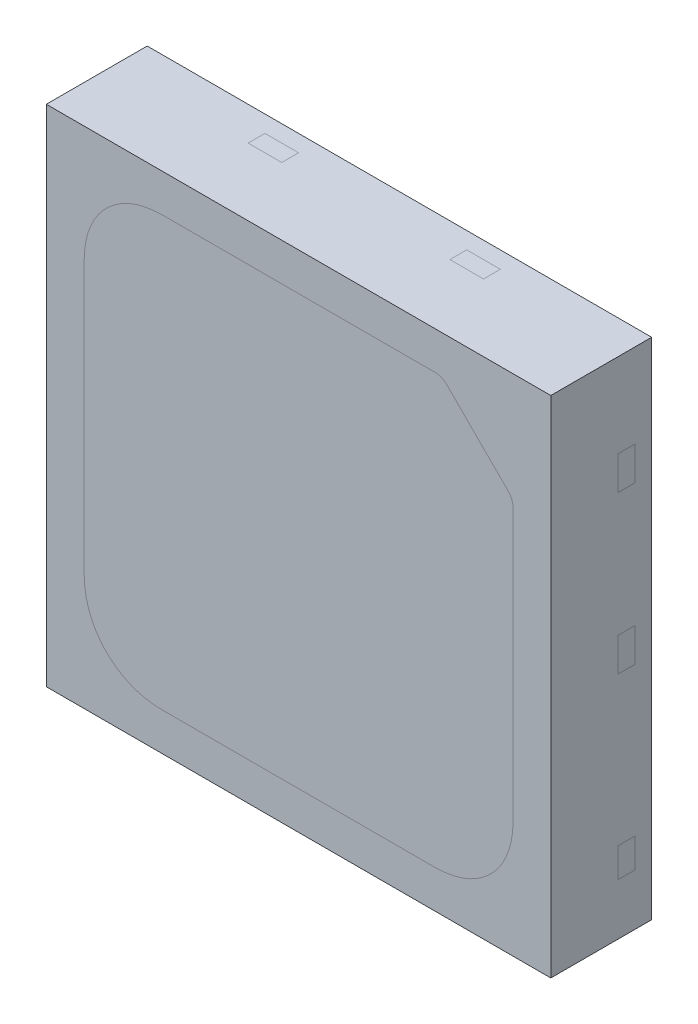
ISO-10303-21;
HEADER;
FILE_DESCRIPTION(('STEP AP214'),'2;1');
FILE_NAME('part.step','',(''),(''),'','','');
FILE_SCHEMA(('AUTOMOTIVE_DESIGN { 1 0 10303 214 1 1 1 1 }'));
ENDSEC;
DATA;
#1=APPLICATION_CONTEXT('core data for automotive mechanical design processes');
#2=APPLICATION_PROTOCOL_DEFINITION('international standard','automotive_design',2000,#1);
#3=PRODUCT_CONTEXT('',#1,'mechanical');
#4=PRODUCT('Part','Part','',(#3));
#5=PRODUCT_RELATED_PRODUCT_CATEGORY('part','',(#4));
#6=PRODUCT_DEFINITION_FORMATION('','',#4);
#7=PRODUCT_DEFINITION_CONTEXT('part definition',#1,'design');
#8=PRODUCT_DEFINITION('design','',#6,#7);
#9=PRODUCT_DEFINITION_SHAPE('','',#8);
#10=(LENGTH_UNIT() NAMED_UNIT(*) SI_UNIT(.MILLI.,.METRE.));
#11=(NAMED_UNIT(*) PLANE_ANGLE_UNIT() SI_UNIT($,.RADIAN.));
#12=(NAMED_UNIT(*) SI_UNIT($,.STERADIAN.) SOLID_ANGLE_UNIT());
#13=UNCERTAINTY_MEASURE_WITH_UNIT(LENGTH_MEASURE(1.E-05),#10,'distance_accuracy_value','');
#14=(GEOMETRIC_REPRESENTATION_CONTEXT(3) GLOBAL_UNCERTAINTY_ASSIGNED_CONTEXT((#13)) GLOBAL_UNIT_ASSIGNED_CONTEXT((#10,
#11,#12)) REPRESENTATION_CONTEXT('',''));
#15=CARTESIAN_POINT('',(0.,0.,0.));
#16=DIRECTION('',(0.,0.,1.));
#17=DIRECTION('',(1.,0.,0.));
#18=AXIS2_PLACEMENT_3D('',#15,#16,#17);
#19=CARTESIAN_POINT('',(-0.900000085160002,-1.24499989786669,0.));
#20=DIRECTION('',(0.,0.,1.));
#21=DIRECTION('',(1.,0.,0.));
#22=AXIS2_PLACEMENT_3D('',#19,#20,#21);
#23=PLANE('',#22);
#24=DIRECTION('',(-1.,0.,0.));
#25=VECTOR('',#24,1.);
#26=CARTESIAN_POINT('',(1.5,-0.764999897866658,0.));
#27=LINE('',#26,#25);
#28=CARTESIAN_POINT('',(0.900000000335438,-0.764999897866658,0.));
#29=VERTEX_POINT('',#28);
#30=CARTESIAN_POINT('',(-0.900000085160002,-0.764999897866658,0.));
#31=VERTEX_POINT('',#30);
#32=EDGE_CURVE('E129',#29,#31,#27,.T.);
#33=ORIENTED_EDGE('',*,*,#32,.F.);
#34=CARTESIAN_POINT('',(1.00000000033543,-0.864999897866647,0.));
#35=CARTESIAN_POINT('',(0.998684304954096,-0.822997155944478,0.));
#36=CARTESIAN_POINT('',(0.970970174894681,-0.794553357773646,0.));
#37=CARTESIAN_POINT('',(0.943508522697015,-0.76636868479732,0.));
#38=CARTESIAN_POINT('',(0.900000000335438,-0.764999897866658,0.));
#39=B_SPLINE_CURVE_WITH_KNOTS('',2,(#34,#35,#36,#37,#38),.UNSPECIFIED.,.F.,.F.,(3,2,3),(0.,0.5,
1.),.UNSPECIFIED.);
#40=CARTESIAN_POINT('',(1.00000000033543,-0.864999897866647,0.));
#41=VERTEX_POINT('',#40);
#42=EDGE_CURVE('E132',#41,#29,#39,.T.);
#43=ORIENTED_EDGE('',*,*,#42,.F.);
#44=DIRECTION('',(0.,1.,0.));
#45=VECTOR('',#44,1.);
#46=CARTESIAN_POINT('',(1.00000000033543,-1.24499989786669,0.));
#47=LINE('',#46,#45);
#48=CARTESIAN_POINT('',(1.00000000033543,-1.24499989786669,0.));
#49=VERTEX_POINT('',#48);
#50=EDGE_CURVE('E18',#49,#41,#47,.T.);
#51=ORIENTED_EDGE('',*,*,#50,.F.);
#52=CARTESIAN_POINT('',(0.900000000335438,-1.34499989786666,0.));
#53=CARTESIAN_POINT('',(0.942002742257597,-1.34368420248534,0.));
#54=CARTESIAN_POINT('',(0.970446540428437,-1.31597007242593,0.));
#55=CARTESIAN_POINT('',(0.998631213404765,-1.28850842022828,0.));
#56=CARTESIAN_POINT('',(1.00000000033543,-1.24499989786669,0.));
#57=B_SPLINE_CURVE_WITH_KNOTS('',2,(#52,#53,#54,#55,#56),.UNSPECIFIED.,.F.,.F.,(3,2,3),(0.,0.5,
1.),.UNSPECIFIED.);
#58=CARTESIAN_POINT('',(0.900000000335438,-1.34499989786666,0.));
#59=VERTEX_POINT('',#58);
#60=EDGE_CURVE('E107',#59,#49,#57,.T.);
#61=ORIENTED_EDGE('',*,*,#60,.F.);
#62=DIRECTION('',(-1.,0.,0.));
#63=VECTOR('',#62,1.);
#64=CARTESIAN_POINT('',(1.5,-1.34499989786666,0.));
#65=LINE('',#64,#63);
#66=CARTESIAN_POINT('',(-0.900000085160002,-1.34499989786666,0.));
#67=VERTEX_POINT('',#66);
#68=EDGE_CURVE('E109',#67,#59,#65,.F.);
#69=ORIENTED_EDGE('',*,*,#68,.F.);
#70=CARTESIAN_POINT('',(-1.00000008515999,-1.24499989786669,0.));
#71=CARTESIAN_POINT('',(-0.99868438977866,-1.28700263978886,0.));
#72=CARTESIAN_POINT('',(-0.970970259719245,-1.31544643795969,0.));
#73=CARTESIAN_POINT('',(-0.943508607521579,-1.34363111093601,0.));
#74=CARTESIAN_POINT('',(-0.900000085160002,-1.34499989786666,0.));
#75=B_SPLINE_CURVE_WITH_KNOTS('',2,(#70,#71,#72,#73,#74),.UNSPECIFIED.,.F.,.F.,(3,2,3),(0.,0.5,
1.),.UNSPECIFIED.);
#76=CARTESIAN_POINT('',(-1.00000008515999,-1.24499989786669,0.));
#77=VERTEX_POINT('',#76);
#78=EDGE_CURVE('E116',#77,#67,#75,.T.);
#79=ORIENTED_EDGE('',*,*,#78,.F.);
#80=DIRECTION('',(0.,1.,0.));
#81=VECTOR('',#80,1.);
#82=CARTESIAN_POINT('',(-1.00000008515999,1.5,0.));
#83=LINE('',#82,#81);
#84=CARTESIAN_POINT('',(-1.00000008515999,-0.864999897866647,0.));
#85=VERTEX_POINT('',#84);
#86=EDGE_CURVE('E122',#85,#77,#83,.F.);
#87=ORIENTED_EDGE('',*,*,#86,.F.);
#88=CARTESIAN_POINT('',(-0.900000085160002,-0.764999897866658,0.));
#89=CARTESIAN_POINT('',(-0.942002827082158,-0.766315593247989,0.));
#90=CARTESIAN_POINT('',(-0.970446625252997,-0.794029723307398,0.));
#91=CARTESIAN_POINT('',(-0.998631298229329,-0.821491375505056,0.));
#92=CARTESIAN_POINT('',(-1.00000008515999,-0.864999897866647,0.));
#93=B_SPLINE_CURVE_WITH_KNOTS('',2,(#88,#89,#90,#91,#92),.UNSPECIFIED.,.F.,.F.,(3,2,3),(0.,0.5,
1.),.UNSPECIFIED.);
#94=EDGE_CURVE('E128',#31,#85,#93,.T.);
#95=ORIENTED_EDGE('',*,*,#94,.F.);
#96=EDGE_LOOP('',(#33,#43,#51,#61,#69,#79,#87,#95));
#97=FACE_BOUND('',#96,.T.);
#98=ADVANCED_FACE('F15',(#97),#23,.F.);
#99=CARTESIAN_POINT('',(1.10000001458468,1.23500010213334,0.));
#100=DIRECTION('',(0.,0.,-1.));
#101=DIRECTION('',(-1.,0.,0.));
#102=AXIS2_PLACEMENT_3D('',#99,#100,#101);
#103=PLANE('',#102);
#104=CARTESIAN_POINT('',(1.10000001458468,-0.214999897866663,0.));
#105=CARTESIAN_POINT('',(1.14200275650685,-0.213684202485333,0.));
#106=CARTESIAN_POINT('',(1.17044655467768,-0.185970072425921,0.));
#107=CARTESIAN_POINT('',(1.19863122765401,-0.15850842022826,0.));
#108=CARTESIAN_POINT('',(1.20000001458467,-0.114999897866674,0.));
#109=B_SPLINE_CURVE_WITH_KNOTS('',2,(#104,#105,#106,#107,#108),.UNSPECIFIED.,.F.,.F.,(3,2,3),
(0.,0.5,1.),.UNSPECIFIED.);
#110=CARTESIAN_POINT('',(1.10000001458468,-0.214999897866663,0.));
#111=VERTEX_POINT('',#110);
#112=CARTESIAN_POINT('',(1.20000001458467,-0.114999897866674,0.));
#113=VERTEX_POINT('',#112);
#114=EDGE_CURVE('E196',#111,#113,#109,.T.);
#115=ORIENTED_EDGE('',*,*,#114,.F.);
#116=DIRECTION('',(-1.,0.,0.));
#117=VECTOR('',#116,1.);
#118=CARTESIAN_POINT('',(1.5,-0.214999897866663,0.));
#119=LINE('',#118,#117);
#120=CARTESIAN_POINT('',(-1.10003380164489,-0.214999897866663,0.));
#121=VERTEX_POINT('',#120);
#122=EDGE_CURVE('E120',#121,#111,#119,.F.);
#123=ORIENTED_EDGE('',*,*,#122,.F.);
#124=CARTESIAN_POINT('',(-1.20003380164488,-0.114999897866674,0.));
#125=CARTESIAN_POINT('',(-1.19871810626355,-0.157002639788836,0.));
#126=CARTESIAN_POINT('',(-1.17100397620413,-0.185446437959674,0.));
#127=CARTESIAN_POINT('',(-1.14354232400648,-0.213631110936001,0.));
#128=CARTESIAN_POINT('',(-1.10003380164489,-0.214999897866663,0.));
#129=B_SPLINE_CURVE_WITH_KNOTS('',2,(#124,#125,#126,#127,#128),.UNSPECIFIED.,.F.,.F.,(3,2,3),
(0.,0.5,1.),.UNSPECIFIED.);
#130=CARTESIAN_POINT('',(-1.20003380164488,-0.114999897866674,0.));
#131=VERTEX_POINT('',#130);
#132=EDGE_CURVE('E117',#131,#121,#129,.T.);
#133=ORIENTED_EDGE('',*,*,#132,.F.);
#134=DIRECTION('',(0.,1.,0.));
#135=VECTOR('',#134,1.);
#136=CARTESIAN_POINT('',(-1.20003380164488,1.23500010213334,0.));
#137=LINE('',#136,#135);
#138=CARTESIAN_POINT('',(-1.20003380164488,1.23500010213334,0.));
#139=VERTEX_POINT('',#138);
#140=EDGE_CURVE('E135',#131,#139,#137,.T.);
#141=ORIENTED_EDGE('',*,*,#140,.T.);
#142=CARTESIAN_POINT('',(-1.20003380164488,1.23500010213334,0.));
#143=CARTESIAN_POINT('',(-1.1986949889653,1.27755585723485,0.));
#144=CARTESIAN_POINT('',(-1.17048034173789,1.30597027669259,0.));
#145=CARTESIAN_POINT('',(-1.14299073953656,1.33365451748353,0.));
#146=CARTESIAN_POINT('',(-1.10003380164489,1.33500010213333,0.));
#147=B_SPLINE_CURVE_WITH_KNOTS('',2,(#142,#143,#144,#145,#146),.UNSPECIFIED.,.F.,.F.,(3,2,3),
(0.,0.5,1.),.UNSPECIFIED.);
#148=CARTESIAN_POINT('',(-1.10003380164489,1.33500010213333,0.));
#149=VERTEX_POINT('',#148);
#150=EDGE_CURVE('E133',#139,#149,#147,.T.);
#151=ORIENTED_EDGE('',*,*,#150,.T.);
#152=DIRECTION('',(-1.,0.,0.));
#153=VECTOR('',#152,1.);
#154=CARTESIAN_POINT('',(1.5,1.33500010213333,0.));
#155=LINE('',#154,#153);
#156=CARTESIAN_POINT('',(1.10000001458468,1.33500010213333,0.));
#157=VERTEX_POINT('',#156);
#158=EDGE_CURVE('E209',#157,#149,#155,.T.);
#159=ORIENTED_EDGE('',*,*,#158,.F.);
#160=CARTESIAN_POINT('',(1.20000001458467,1.23500010213334,0.));
#161=CARTESIAN_POINT('',(1.19868431920334,1.2770028440555,0.));
#162=CARTESIAN_POINT('',(1.17097018914393,1.30544664222634,0.));
#163=CARTESIAN_POINT('',(1.14350853694627,1.33363131520267,0.));
#164=CARTESIAN_POINT('',(1.10000001458468,1.33500010213333,0.));
#165=B_SPLINE_CURVE_WITH_KNOTS('',2,(#160,#161,#162,#163,#164),.UNSPECIFIED.,.F.,.F.,(3,2,3),
(0.,0.5,1.),.UNSPECIFIED.);
#166=CARTESIAN_POINT('',(1.20000001458467,1.23500010213334,0.));
#167=VERTEX_POINT('',#166);
#168=EDGE_CURVE('E200',#167,#157,#165,.T.);
#169=ORIENTED_EDGE('',*,*,#168,.F.);
#170=DIRECTION('',(0.,1.,0.));
#171=VECTOR('',#170,1.);
#172=CARTESIAN_POINT('',(1.20000001458467,1.5,0.));
#173=LINE('',#172,#171);
#174=EDGE_CURVE('E199',#113,#167,#173,.T.);
#175=ORIENTED_EDGE('',*,*,#174,.F.);
#176=EDGE_LOOP('',(#115,#123,#133,#141,#151,#159,#169,#175));
#177=FACE_BOUND('',#176,.T.);
#178=ADVANCED_FACE('F136',(#177),#103,.T.);
#179=CARTESIAN_POINT('',(-1.49999999724315,1.49999999724315,0.2));
#180=DIRECTION('',(0.,1.,0.));
#181=DIRECTION('',(0.,0.,1.));
#182=AXIS2_PLACEMENT_3D('',#179,#180,#181);
#183=PLANE('',#182);
#184=DIRECTION('',(0.,0.,-1.));
#185=VECTOR('',#184,1.);
#186=CARTESIAN_POINT('',(-0.699999998621359,1.5,0.6));
#187=LINE('',#186,#185);
#188=CARTESIAN_POINT('',(-0.699999998621359,1.49999999862158,0.1));
#189=VERTEX_POINT('',#188);
#190=CARTESIAN_POINT('',(-0.699999998621359,1.49999999862158,0.2));
#191=VERTEX_POINT('',#190);
#192=EDGE_CURVE('E236',#189,#191,#187,.F.);
#193=ORIENTED_EDGE('',*,*,#192,.T.);
#194=DIRECTION('',(1.,0.,0.));
#195=VECTOR('',#194,1.);
#196=CARTESIAN_POINT('',(-1.5,1.5,0.2));
#197=LINE('',#196,#195);
#198=CARTESIAN_POINT('',(-0.499999998621409,1.49999999862158,0.2));
#199=VERTEX_POINT('',#198);
#200=EDGE_CURVE('E216',#191,#199,#197,.T.);
#201=ORIENTED_EDGE('',*,*,#200,.T.);
#202=DIRECTION('',(0.,0.,-1.));
#203=VECTOR('',#202,1.);
#204=CARTESIAN_POINT('',(-0.499999998621409,1.5,0.6));
#205=LINE('',#204,#203);
#206=CARTESIAN_POINT('',(-0.499999998621409,1.49999999862158,0.1));
#207=VERTEX_POINT('',#206);
#208=EDGE_CURVE('E225',#199,#207,#205,.T.);
#209=ORIENTED_EDGE('',*,*,#208,.T.);
#210=DIRECTION('',(1.,0.,0.));
#211=VECTOR('',#210,1.);
#212=CARTESIAN_POINT('',(-1.5,1.5,0.1));
#213=LINE('',#212,#211);
#214=EDGE_CURVE('E231',#207,#189,#213,.F.);
#215=ORIENTED_EDGE('',*,*,#214,.T.);
#216=EDGE_LOOP('',(#193,#201,#209,#215));
#217=FACE_BOUND('',#216,.T.);
#218=ADVANCED_FACE('F145',(#217),#183,.T.);
#219=CARTESIAN_POINT('',(-1.49999999724315,1.49999999724315,0.2));
#220=DIRECTION('',(0.,1.,0.));
#221=DIRECTION('',(0.,0.,1.));
#222=AXIS2_PLACEMENT_3D('',#219,#220,#221);
#223=PLANE('',#222);
#224=DIRECTION('',(0.,0.,-1.));
#225=VECTOR('',#224,1.);
#226=CARTESIAN_POINT('',(0.500000001378259,1.5,0.6));
#227=LINE('',#226,#225);
#228=CARTESIAN_POINT('',(0.500000001378259,1.49999999862158,0.1));
#229=VERTEX_POINT('',#228);
#230=CARTESIAN_POINT('',(0.500000001378259,1.49999999862158,0.2));
#231=VERTEX_POINT('',#230);
#232=EDGE_CURVE('E250',#229,#231,#227,.F.);
#233=ORIENTED_EDGE('',*,*,#232,.T.);
#234=DIRECTION('',(1.,0.,0.));
#235=VECTOR('',#234,1.);
#236=CARTESIAN_POINT('',(-1.5,1.5,0.2));
#237=LINE('',#236,#235);
#238=CARTESIAN_POINT('',(0.700000001378209,1.49999999862158,0.2));
#239=VERTEX_POINT('',#238);
#240=EDGE_CURVE('E241',#231,#239,#237,.T.);
#241=ORIENTED_EDGE('',*,*,#240,.T.);
#242=DIRECTION('',(0.,0.,-1.));
#243=VECTOR('',#242,1.);
#244=CARTESIAN_POINT('',(0.700000001378209,1.5,0.6));
#245=LINE('',#244,#243);
#246=CARTESIAN_POINT('',(0.700000001378209,1.49999999862158,0.1));
#247=VERTEX_POINT('',#246);
#248=EDGE_CURVE('E244',#239,#247,#245,.T.);
#249=ORIENTED_EDGE('',*,*,#248,.T.);
#250=DIRECTION('',(1.,0.,0.));
#251=VECTOR('',#250,1.);
#252=CARTESIAN_POINT('',(-1.5,1.5,0.1));
#253=LINE('',#252,#251);
#254=EDGE_CURVE('E247',#247,#229,#253,.F.);
#255=ORIENTED_EDGE('',*,*,#254,.T.);
#256=EDGE_LOOP('',(#233,#241,#249,#255));
#257=FACE_BOUND('',#256,.T.);
#258=ADVANCED_FACE('F149',(#257),#223,.T.);
#259=CARTESIAN_POINT('',(1.49999999999999,0.,0.));
#260=DIRECTION('',(-1.,0.,0.));
#261=DIRECTION('',(0.,0.,1.));
#262=AXIS2_PLACEMENT_3D('',#259,#260,#261);
#263=PLANE('',#262);
#264=DIRECTION('',(0.,0.,1.));
#265=VECTOR('',#264,1.);
#266=CARTESIAN_POINT('',(1.5,1.0000000496882,0.6));
#267=LINE('',#266,#265);
#268=CARTESIAN_POINT('',(1.5,1.0000000496882,0.1));
#269=VERTEX_POINT('',#268);
#270=CARTESIAN_POINT('',(1.5,1.0000000496882,0.2));
#271=VERTEX_POINT('',#270);
#272=EDGE_CURVE('E268',#269,#271,#267,.T.);
#273=ORIENTED_EDGE('',*,*,#272,.T.);
#274=DIRECTION('',(0.,1.,0.));
#275=VECTOR('',#274,1.);
#276=CARTESIAN_POINT('',(1.5,-1.5,0.2));
#277=LINE('',#276,#275);
#278=CARTESIAN_POINT('',(1.5,0.800000049688165,0.2));
#279=VERTEX_POINT('',#278);
#280=EDGE_CURVE('E259',#271,#279,#277,.F.);
#281=ORIENTED_EDGE('',*,*,#280,.T.);
#282=DIRECTION('',(0.,0.,1.));
#283=VECTOR('',#282,1.);
#284=CARTESIAN_POINT('',(1.5,0.800000049688165,0.6));
#285=LINE('',#284,#283);
#286=CARTESIAN_POINT('',(1.5,0.800000049688165,0.1));
#287=VERTEX_POINT('',#286);
#288=EDGE_CURVE('E262',#279,#287,#285,.F.);
#289=ORIENTED_EDGE('',*,*,#288,.T.);
#290=DIRECTION('',(0.,1.,0.));
#291=VECTOR('',#290,1.);
#292=CARTESIAN_POINT('',(1.5,-1.5,0.1));
#293=LINE('',#292,#291);
#294=EDGE_CURVE('E265',#287,#269,#293,.T.);
#295=ORIENTED_EDGE('',*,*,#294,.T.);
#296=EDGE_LOOP('',(#273,#281,#289,#295));
#297=FACE_BOUND('',#296,.T.);
#298=ADVANCED_FACE('F153',(#297),#263,.F.);
#299=CARTESIAN_POINT('',(1.5,0.,0.));
#300=DIRECTION('',(1.,0.,0.));
#301=DIRECTION('',(0.,0.,-1.));
#302=AXIS2_PLACEMENT_3D('',#299,#300,#301);
#303=PLANE('',#302);
#304=DIRECTION('',(0.,1.,0.));
#305=VECTOR('',#304,1.);
#306=CARTESIAN_POINT('',(1.5,-1.5,0.2));
#307=LINE('',#306,#305);
#308=CARTESIAN_POINT('',(1.5,0.0647629025983254,0.2));
#309=VERTEX_POINT('',#308);
#310=CARTESIAN_POINT('',(1.5,-0.135237097401708,0.2));
#311=VERTEX_POINT('',#310);
#312=EDGE_CURVE('E271',#309,#311,#307,.F.);
#313=ORIENTED_EDGE('',*,*,#312,.T.);
#314=DIRECTION('',(0.,0.,1.));
#315=VECTOR('',#314,1.);
#316=CARTESIAN_POINT('',(1.5,-0.135237097401708,0.6));
#317=LINE('',#316,#315);
#318=CARTESIAN_POINT('',(1.5,-0.135237097401708,0.1));
#319=VERTEX_POINT('',#318);
#320=EDGE_CURVE('E274',#311,#319,#317,.F.);
#321=ORIENTED_EDGE('',*,*,#320,.T.);
#322=DIRECTION('',(0.,1.,0.));
#323=VECTOR('',#322,1.);
#324=CARTESIAN_POINT('',(1.5,-1.5,0.1));
#325=LINE('',#324,#323);
#326=CARTESIAN_POINT('',(1.5,0.0647629025983254,0.1));
#327=VERTEX_POINT('',#326);
#328=EDGE_CURVE('E277',#319,#327,#325,.T.);
#329=ORIENTED_EDGE('',*,*,#328,.T.);
#330=DIRECTION('',(0.,0.,1.));
#331=VECTOR('',#330,1.);
#332=CARTESIAN_POINT('',(1.5,0.0647629025983254,0.6));
#333=LINE('',#332,#331);
#334=EDGE_CURVE('E280',#327,#309,#333,.T.);
#335=ORIENTED_EDGE('',*,*,#334,.T.);
#336=EDGE_LOOP('',(#313,#321,#329,#335));
#337=FACE_BOUND('',#336,.T.);
#338=ADVANCED_FACE('F157',(#337),#303,.T.);
#339=CARTESIAN_POINT('',(1.5,0.,0.));
#340=DIRECTION('',(-1.,0.,0.));
#341=DIRECTION('',(0.,-1.,0.));
#342=AXIS2_PLACEMENT_3D('',#339,#340,#341);
#343=PLANE('',#342);
#344=DIRECTION('',(0.,0.,1.));
#345=VECTOR('',#344,1.);
#346=CARTESIAN_POINT('',(1.5,-1.01890774120183,0.6));
#347=LINE('',#346,#345);
#348=CARTESIAN_POINT('',(1.5,-1.01890774120183,0.1));
#349=VERTEX_POINT('',#348);
#350=CARTESIAN_POINT('',(1.5,-1.01890774120183,0.2));
#351=VERTEX_POINT('',#350);
#352=EDGE_CURVE('E292',#349,#351,#347,.T.);
#353=ORIENTED_EDGE('',*,*,#352,.T.);
#354=DIRECTION('',(0.,1.,0.));
#355=VECTOR('',#354,1.);
#356=CARTESIAN_POINT('',(1.5,-1.5,0.2));
#357=LINE('',#356,#355);
#358=CARTESIAN_POINT('',(1.5,-1.19390774120187,0.2));
#359=VERTEX_POINT('',#358);
#360=EDGE_CURVE('E283',#351,#359,#357,.F.);
#361=ORIENTED_EDGE('',*,*,#360,.T.);
#362=DIRECTION('',(0.,0.,1.));
#363=VECTOR('',#362,1.);
#364=CARTESIAN_POINT('',(1.5,-1.19390774120187,0.6));
#365=LINE('',#364,#363);
#366=CARTESIAN_POINT('',(1.5,-1.19390774120187,0.1));
#367=VERTEX_POINT('',#366);
#368=EDGE_CURVE('E286',#359,#367,#365,.F.);
#369=ORIENTED_EDGE('',*,*,#368,.T.);
#370=DIRECTION('',(0.,1.,0.));
#371=VECTOR('',#370,1.);
#372=CARTESIAN_POINT('',(1.5,-1.5,0.1));
#373=LINE('',#372,#371);
#374=EDGE_CURVE('E289',#367,#349,#373,.T.);
#375=ORIENTED_EDGE('',*,*,#374,.T.);
#376=EDGE_LOOP('',(#353,#361,#369,#375));
#377=FACE_BOUND('',#376,.T.);
#378=ADVANCED_FACE('F161',(#377),#343,.F.);
#379=CARTESIAN_POINT('',(-1.49999999724315,-1.5,0.2));
#380=DIRECTION('',(0.,-1.,0.));
#381=DIRECTION('',(0.,0.,-1.));
#382=AXIS2_PLACEMENT_3D('',#379,#380,#381);
#383=PLANE('',#382);
#384=DIRECTION('',(0.,0.,1.));
#385=VECTOR('',#384,1.);
#386=CARTESIAN_POINT('',(0.70000000137827,-1.5,0.6));
#387=LINE('',#386,#385);
#388=CARTESIAN_POINT('',(0.70000000137827,-1.5,0.1));
#389=VERTEX_POINT('',#388);
#390=CARTESIAN_POINT('',(0.70000000137827,-1.5,0.2));
#391=VERTEX_POINT('',#390);
#392=EDGE_CURVE('E304',#389,#391,#387,.T.);
#393=ORIENTED_EDGE('',*,*,#392,.T.);
#394=DIRECTION('',(1.,0.,0.));
#395=VECTOR('',#394,1.);
#396=CARTESIAN_POINT('',(-1.5,-1.5,0.2));
#397=LINE('',#396,#395);
#398=CARTESIAN_POINT('',(0.500000001378215,-1.5,0.2));
#399=VERTEX_POINT('',#398);
#400=EDGE_CURVE('E295',#391,#399,#397,.F.);
#401=ORIENTED_EDGE('',*,*,#400,.T.);
#402=DIRECTION('',(0.,0.,1.));
#403=VECTOR('',#402,1.);
#404=CARTESIAN_POINT('',(0.500000001378215,-1.5,0.6));
#405=LINE('',#404,#403);
#406=CARTESIAN_POINT('',(0.500000001378215,-1.5,0.1));
#407=VERTEX_POINT('',#406);
#408=EDGE_CURVE('E298',#399,#407,#405,.F.);
#409=ORIENTED_EDGE('',*,*,#408,.T.);
#410=DIRECTION('',(1.,0.,0.));
#411=VECTOR('',#410,1.);
#412=CARTESIAN_POINT('',(-1.5,-1.5,0.1));
#413=LINE('',#412,#411);
#414=EDGE_CURVE('E301',#407,#389,#413,.T.);
#415=ORIENTED_EDGE('',*,*,#414,.T.);
#416=EDGE_LOOP('',(#393,#401,#409,#415));
#417=FACE_BOUND('',#416,.T.);
#418=ADVANCED_FACE('F165',(#417),#383,.T.);
#419=CARTESIAN_POINT('',(-1.49999999724315,-1.5,0.2));
#420=DIRECTION('',(0.,-1.,0.));
#421=DIRECTION('',(0.,0.,-1.));
#422=AXIS2_PLACEMENT_3D('',#419,#420,#421);
#423=PLANE('',#422);
#424=DIRECTION('',(0.,0.,1.));
#425=VECTOR('',#424,1.);
#426=CARTESIAN_POINT('',(-0.499999998621348,-1.5,0.6));
#427=LINE('',#426,#425);
#428=CARTESIAN_POINT('',(-0.499999998621348,-1.5,0.1));
#429=VERTEX_POINT('',#428);
#430=CARTESIAN_POINT('',(-0.499999998621348,-1.5,0.2));
#431=VERTEX_POINT('',#430);
#432=EDGE_CURVE('E322',#429,#431,#427,.T.);
#433=ORIENTED_EDGE('',*,*,#432,.T.);
#434=DIRECTION('',(1.,0.,0.));
#435=VECTOR('',#434,1.);
#436=CARTESIAN_POINT('',(-1.5,-1.5,0.2));
#437=LINE('',#436,#435);
#438=CARTESIAN_POINT('',(-0.699999998621389,-1.5,0.2));
#439=VERTEX_POINT('',#438);
#440=EDGE_CURVE('E313',#431,#439,#437,.F.);
#441=ORIENTED_EDGE('',*,*,#440,.T.);
#442=DIRECTION('',(0.,0.,1.));
#443=VECTOR('',#442,1.);
#444=CARTESIAN_POINT('',(-0.699999998621389,-1.5,0.6));
#445=LINE('',#444,#443);
#446=CARTESIAN_POINT('',(-0.699999998621389,-1.5,0.1));
#447=VERTEX_POINT('',#446);
#448=EDGE_CURVE('E316',#439,#447,#445,.F.);
#449=ORIENTED_EDGE('',*,*,#448,.T.);
#450=DIRECTION('',(1.,0.,0.));
#451=VECTOR('',#450,1.);
#452=CARTESIAN_POINT('',(-1.5,-1.5,0.1));
#453=LINE('',#452,#451);
#454=EDGE_CURVE('E319',#447,#429,#453,.T.);
#455=ORIENTED_EDGE('',*,*,#454,.T.);
#456=EDGE_LOOP('',(#433,#441,#449,#455));
#457=FACE_BOUND('',#456,.T.);
#458=ADVANCED_FACE('F169',(#457),#423,.T.);
#459=CARTESIAN_POINT('',(1.5,1.5,0.));
#460=DIRECTION('',(0.,0.,-1.));
#461=DIRECTION('',(-1.,0.,0.));
#462=AXIS2_PLACEMENT_3D('',#459,#460,#461);
#463=PLANE('',#462);
#464=DIRECTION('',(0.,1.,0.));
#465=VECTOR('',#464,1.);
#466=CARTESIAN_POINT('',(-1.5,-1.5,0.));
#467=LINE('',#466,#465);
#468=CARTESIAN_POINT('',(-1.5,-1.5,0.));
#469=VERTEX_POINT('',#468);
#470=CARTESIAN_POINT('',(-1.5,1.5,0.));
#471=VERTEX_POINT('',#470);
#472=EDGE_CURVE('E328',#469,#471,#467,.T.);
#473=ORIENTED_EDGE('',*,*,#472,.T.);
#474=DIRECTION('',(1.,0.,0.));
#475=VECTOR('',#474,1.);
#476=CARTESIAN_POINT('',(-1.5,1.5,0.));
#477=LINE('',#476,#475);
#478=CARTESIAN_POINT('',(1.5,1.5,0.));
#479=VERTEX_POINT('',#478);
#480=EDGE_CURVE('E238',#471,#479,#477,.T.);
#481=ORIENTED_EDGE('',*,*,#480,.T.);
#482=DIRECTION('',(0.,1.,0.));
#483=VECTOR('',#482,1.);
#484=CARTESIAN_POINT('',(1.5,-1.5,0.));
#485=LINE('',#484,#483);
#486=CARTESIAN_POINT('',(1.5,-1.5,0.));
#487=VERTEX_POINT('',#486);
#488=EDGE_CURVE('E256',#479,#487,#485,.F.);
#489=ORIENTED_EDGE('',*,*,#488,.T.);
#490=DIRECTION('',(1.,0.,0.));
#491=VECTOR('',#490,1.);
#492=CARTESIAN_POINT('',(-1.5,-1.5,0.));
#493=LINE('',#492,#491);
#494=EDGE_CURVE('E310',#487,#469,#493,.F.);
#495=ORIENTED_EDGE('',*,*,#494,.T.);
#496=EDGE_LOOP('',(#473,#481,#489,#495));
#497=FACE_BOUND('',#496,.T.);
#498=ORIENTED_EDGE('',*,*,#150,.F.);
#499=ORIENTED_EDGE('',*,*,#140,.F.);
#500=ORIENTED_EDGE('',*,*,#132,.T.);
#501=ORIENTED_EDGE('',*,*,#122,.T.);
#502=ORIENTED_EDGE('',*,*,#114,.T.);
#503=ORIENTED_EDGE('',*,*,#174,.T.);
#504=ORIENTED_EDGE('',*,*,#168,.T.);
#505=ORIENTED_EDGE('',*,*,#158,.T.);
#506=EDGE_LOOP('',(#498,#499,#500,#501,#502,#503,#504,#505));
#507=FACE_BOUND('',#506,.T.);
#508=ORIENTED_EDGE('',*,*,#60,.T.);
#509=ORIENTED_EDGE('',*,*,#50,.T.);
#510=ORIENTED_EDGE('',*,*,#42,.T.);
#511=ORIENTED_EDGE('',*,*,#32,.T.);
#512=ORIENTED_EDGE('',*,*,#94,.T.);
#513=ORIENTED_EDGE('',*,*,#86,.T.);
#514=ORIENTED_EDGE('',*,*,#78,.T.);
#515=ORIENTED_EDGE('',*,*,#68,.T.);
#516=EDGE_LOOP('',(#508,#509,#510,#511,#512,#513,#514,#515));
#517=FACE_BOUND('',#516,.T.);
#518=ADVANCED_FACE('F114',(#497,#507,#517),#463,.T.);
#519=CARTESIAN_POINT('',(-1.5,0.,0.));
#520=DIRECTION('',(-1.,0.,0.));
#521=DIRECTION('',(0.,0.,1.));
#522=AXIS2_PLACEMENT_3D('',#519,#520,#521);
#523=PLANE('',#522);
#524=DIRECTION('',(0.,1.,0.));
#525=VECTOR('',#524,1.);
#526=CARTESIAN_POINT('',(-1.5,-1.5,0.2));
#527=LINE('',#526,#525);
#528=CARTESIAN_POINT('',(-1.5,-0.135237097401708,0.2));
#529=VERTEX_POINT('',#528);
#530=CARTESIAN_POINT('',(-1.5,0.0647629025983254,0.2));
#531=VERTEX_POINT('',#530);
#532=EDGE_CURVE('E334',#529,#531,#527,.T.);
#533=ORIENTED_EDGE('',*,*,#532,.T.);
#534=DIRECTION('',(0.,0.,-1.));
#535=VECTOR('',#534,1.);
#536=CARTESIAN_POINT('',(-1.5,0.0647629025983254,0.6));
#537=LINE('',#536,#535);
#538=CARTESIAN_POINT('',(-1.5,0.0647629025983254,0.1));
#539=VERTEX_POINT('',#538);
#540=EDGE_CURVE('E337',#531,#539,#537,.T.);
#541=ORIENTED_EDGE('',*,*,#540,.T.);
#542=DIRECTION('',(0.,1.,0.));
#543=VECTOR('',#542,1.);
#544=CARTESIAN_POINT('',(-1.5,-1.5,0.1));
#545=LINE('',#544,#543);
#546=CARTESIAN_POINT('',(-1.5,-0.135237097401708,0.1));
#547=VERTEX_POINT('',#546);
#548=EDGE_CURVE('E340',#539,#547,#545,.F.);
#549=ORIENTED_EDGE('',*,*,#548,.T.);
#550=DIRECTION('',(0.,0.,-1.));
#551=VECTOR('',#550,1.);
#552=CARTESIAN_POINT('',(-1.5,-0.135237097401708,0.6));
#553=LINE('',#552,#551);
#554=EDGE_CURVE('E343',#547,#529,#553,.F.);
#555=ORIENTED_EDGE('',*,*,#554,.T.);
#556=EDGE_LOOP('',(#533,#541,#549,#555));
#557=FACE_BOUND('',#556,.T.);
#558=ADVANCED_FACE('F177',(#557),#523,.T.);
#559=CARTESIAN_POINT('',(-1.5,0.,0.));
#560=DIRECTION('',(-1.,0.,0.));
#561=DIRECTION('',(0.,0.,1.));
#562=AXIS2_PLACEMENT_3D('',#559,#560,#561);
#563=PLANE('',#562);
#564=DIRECTION('',(0.,1.,0.));
#565=VECTOR('',#564,1.);
#566=CARTESIAN_POINT('',(-1.5,-1.5,0.2));
#567=LINE('',#566,#565);
#568=CARTESIAN_POINT('',(-1.5,0.800000049688165,0.2));
#569=VERTEX_POINT('',#568);
#570=CARTESIAN_POINT('',(-1.5,1.0000000496882,0.2));
#571=VERTEX_POINT('',#570);
#572=EDGE_CURVE('E346',#569,#571,#567,.T.);
#573=ORIENTED_EDGE('',*,*,#572,.T.);
#574=DIRECTION('',(0.,0.,-1.));
#575=VECTOR('',#574,1.);
#576=CARTESIAN_POINT('',(-1.5,1.0000000496882,0.6));
#577=LINE('',#576,#575);
#578=CARTESIAN_POINT('',(-1.5,1.0000000496882,0.1));
#579=VERTEX_POINT('',#578);
#580=EDGE_CURVE('E349',#571,#579,#577,.T.);
#581=ORIENTED_EDGE('',*,*,#580,.T.);
#582=DIRECTION('',(0.,1.,0.));
#583=VECTOR('',#582,1.);
#584=CARTESIAN_POINT('',(-1.5,-1.5,0.1));
#585=LINE('',#584,#583);
#586=CARTESIAN_POINT('',(-1.5,0.800000049688165,0.1));
#587=VERTEX_POINT('',#586);
#588=EDGE_CURVE('E352',#579,#587,#585,.F.);
#589=ORIENTED_EDGE('',*,*,#588,.T.);
#590=DIRECTION('',(0.,0.,-1.));
#591=VECTOR('',#590,1.);
#592=CARTESIAN_POINT('',(-1.5,0.800000049688165,0.6));
#593=LINE('',#592,#591);
#594=EDGE_CURVE('E355',#587,#569,#593,.F.);
#595=ORIENTED_EDGE('',*,*,#594,.T.);
#596=EDGE_LOOP('',(#573,#581,#589,#595));
#597=FACE_BOUND('',#596,.T.);
#598=ADVANCED_FACE('F538',(#597),#563,.T.);
#599=CARTESIAN_POINT('',(-1.5,0.,0.));
#600=DIRECTION('',(-1.,0.,0.));
#601=DIRECTION('',(0.,-1.,0.));
#602=AXIS2_PLACEMENT_3D('',#599,#600,#601);
#603=PLANE('',#602);
#604=DIRECTION('',(0.,1.,0.));
#605=VECTOR('',#604,1.);
#606=CARTESIAN_POINT('',(-1.5,-1.5,0.2));
#607=LINE('',#606,#605);
#608=CARTESIAN_POINT('',(-1.5,-1.19390774120187,0.2));
#609=VERTEX_POINT('',#608);
#610=CARTESIAN_POINT('',(-1.5,-1.01890774120178,0.2));
#611=VERTEX_POINT('',#610);
#612=EDGE_CURVE('E358',#609,#611,#607,.T.);
#613=ORIENTED_EDGE('',*,*,#612,.T.);
#614=DIRECTION('',(0.,0.,-1.));
#615=VECTOR('',#614,1.);
#616=CARTESIAN_POINT('',(-1.5,-1.01890774120178,0.6));
#617=LINE('',#616,#615);
#618=CARTESIAN_POINT('',(-1.5,-1.01890774120178,0.1));
#619=VERTEX_POINT('',#618);
#620=EDGE_CURVE('E361',#611,#619,#617,.T.);
#621=ORIENTED_EDGE('',*,*,#620,.T.);
#622=DIRECTION('',(0.,1.,0.));
#623=VECTOR('',#622,1.);
#624=CARTESIAN_POINT('',(-1.5,-1.5,0.1));
#625=LINE('',#624,#623);
#626=CARTESIAN_POINT('',(-1.5,-1.19390774120187,0.1));
#627=VERTEX_POINT('',#626);
#628=EDGE_CURVE('E364',#619,#627,#625,.F.);
#629=ORIENTED_EDGE('',*,*,#628,.T.);
#630=DIRECTION('',(0.,0.,-1.));
#631=VECTOR('',#630,1.);
#632=CARTESIAN_POINT('',(-1.5,-1.19390774120187,0.6));
#633=LINE('',#632,#631);
#634=EDGE_CURVE('E367',#627,#609,#633,.F.);
#635=ORIENTED_EDGE('',*,*,#634,.T.);
#636=EDGE_LOOP('',(#613,#621,#629,#635));
#637=FACE_BOUND('',#636,.T.);
#638=ADVANCED_FACE('F529',(#637),#603,.T.);
#639=CARTESIAN_POINT('',(-1.5,1.5,0.6));
#640=DIRECTION('',(0.,-1.,0.));
#641=DIRECTION('',(0.,0.,-1.));
#642=AXIS2_PLACEMENT_3D('',#639,#640,#641);
#643=PLANE('',#642);
#644=ORIENTED_EDGE('',*,*,#254,.F.);
#645=ORIENTED_EDGE('',*,*,#248,.F.);
#646=ORIENTED_EDGE('',*,*,#240,.F.);
#647=ORIENTED_EDGE('',*,*,#232,.F.);
#648=EDGE_LOOP('',(#644,#645,#646,#647));
#649=FACE_BOUND('',#648,.T.);
#650=DIRECTION('',(0.,0.,1.));
#651=VECTOR('',#650,1.);
#652=CARTESIAN_POINT('',(1.5,1.5,0.6));
#653=LINE('',#652,#651);
#654=CARTESIAN_POINT('',(1.5,1.5,0.6));
#655=VERTEX_POINT('',#654);
#656=EDGE_CURVE('E253',#655,#479,#653,.F.);
#657=ORIENTED_EDGE('',*,*,#656,.T.);
#658=ORIENTED_EDGE('',*,*,#480,.F.);
#659=DIRECTION('',(0.,0.,-1.));
#660=VECTOR('',#659,1.);
#661=CARTESIAN_POINT('',(-1.5,1.5,0.6));
#662=LINE('',#661,#660);
#663=CARTESIAN_POINT('',(-1.5,1.5,0.6));
#664=VERTEX_POINT('',#663);
#665=EDGE_CURVE('E331',#471,#664,#662,.F.);
#666=ORIENTED_EDGE('',*,*,#665,.T.);
#667=DIRECTION('',(-1.,0.,0.));
#668=VECTOR('',#667,1.);
#669=CARTESIAN_POINT('',(1.5,1.5,0.6));
#670=LINE('',#669,#668);
#671=EDGE_CURVE('E370',#664,#655,#670,.F.);
#672=ORIENTED_EDGE('',*,*,#671,.T.);
#673=EDGE_LOOP('',(#657,#658,#666,#672));
#674=FACE_BOUND('',#673,.T.);
#675=ORIENTED_EDGE('',*,*,#214,.F.);
#676=ORIENTED_EDGE('',*,*,#208,.F.);
#677=ORIENTED_EDGE('',*,*,#200,.F.);
#678=ORIENTED_EDGE('',*,*,#192,.F.);
#679=EDGE_LOOP('',(#675,#676,#677,#678));
#680=FACE_BOUND('',#679,.T.);
#681=ADVANCED_FACE('F468',(#649,#674,#680),#643,.F.);
#682=CARTESIAN_POINT('',(1.5,-1.5,0.6));
#683=DIRECTION('',(-1.,0.,0.));
#684=DIRECTION('',(0.,0.,1.));
#685=AXIS2_PLACEMENT_3D('',#682,#683,#684);
#686=PLANE('',#685);
#687=ORIENTED_EDGE('',*,*,#374,.F.);
#688=ORIENTED_EDGE('',*,*,#368,.F.);
#689=ORIENTED_EDGE('',*,*,#360,.F.);
#690=ORIENTED_EDGE('',*,*,#352,.F.);
#691=EDGE_LOOP('',(#687,#688,#689,#690));
#692=FACE_BOUND('',#691,.T.);
#693=ORIENTED_EDGE('',*,*,#328,.F.);
#694=ORIENTED_EDGE('',*,*,#320,.F.);
#695=ORIENTED_EDGE('',*,*,#312,.F.);
#696=ORIENTED_EDGE('',*,*,#334,.F.);
#697=EDGE_LOOP('',(#693,#694,#695,#696));
#698=FACE_BOUND('',#697,.T.);
#699=ORIENTED_EDGE('',*,*,#294,.F.);
#700=ORIENTED_EDGE('',*,*,#288,.F.);
#701=ORIENTED_EDGE('',*,*,#280,.F.);
#702=ORIENTED_EDGE('',*,*,#272,.F.);
#703=EDGE_LOOP('',(#699,#700,#701,#702));
#704=FACE_BOUND('',#703,.T.);
#705=DIRECTION('',(0.,0.,1.));
#706=VECTOR('',#705,1.);
#707=CARTESIAN_POINT('',(1.5,-1.5,0.6));
#708=LINE('',#707,#706);
#709=CARTESIAN_POINT('',(1.5,-1.5,0.6));
#710=VERTEX_POINT('',#709);
#711=EDGE_CURVE('E307',#710,#487,#708,.F.);
#712=ORIENTED_EDGE('',*,*,#711,.T.);
#713=ORIENTED_EDGE('',*,*,#488,.F.);
#714=ORIENTED_EDGE('',*,*,#656,.F.);
#715=DIRECTION('',(0.,1.,0.));
#716=VECTOR('',#715,1.);
#717=CARTESIAN_POINT('',(1.5,1.5,0.6));
#718=LINE('',#717,#716);
#719=EDGE_CURVE('E373',#655,#710,#718,.F.);
#720=ORIENTED_EDGE('',*,*,#719,.T.);
#721=EDGE_LOOP('',(#712,#713,#714,#720));
#722=FACE_BOUND('',#721,.T.);
#723=ADVANCED_FACE('F476',(#692,#698,#704,#722),#686,.F.);
#724=CARTESIAN_POINT('',(-1.5,-1.5,0.6));
#725=DIRECTION('',(0.,1.,0.));
#726=DIRECTION('',(0.,0.,1.));
#727=AXIS2_PLACEMENT_3D('',#724,#725,#726);
#728=PLANE('',#727);
#729=ORIENTED_EDGE('',*,*,#454,.F.);
#730=ORIENTED_EDGE('',*,*,#448,.F.);
#731=ORIENTED_EDGE('',*,*,#440,.F.);
#732=ORIENTED_EDGE('',*,*,#432,.F.);
#733=EDGE_LOOP('',(#729,#730,#731,#732));
#734=FACE_BOUND('',#733,.T.);
#735=DIRECTION('',(0.,0.,-1.));
#736=VECTOR('',#735,1.);
#737=CARTESIAN_POINT('',(-1.5,-1.5,0.6));
#738=LINE('',#737,#736);
#739=CARTESIAN_POINT('',(-1.5,-1.5,0.6));
#740=VERTEX_POINT('',#739);
#741=EDGE_CURVE('E325',#740,#469,#738,.T.);
#742=ORIENTED_EDGE('',*,*,#741,.T.);
#743=ORIENTED_EDGE('',*,*,#494,.F.);
#744=ORIENTED_EDGE('',*,*,#711,.F.);
#745=DIRECTION('',(-1.,0.,0.));
#746=VECTOR('',#745,1.);
#747=CARTESIAN_POINT('',(1.5,-1.5,0.6));
#748=LINE('',#747,#746);
#749=EDGE_CURVE('E376',#710,#740,#748,.T.);
#750=ORIENTED_EDGE('',*,*,#749,.T.);
#751=EDGE_LOOP('',(#742,#743,#744,#750));
#752=FACE_BOUND('',#751,.T.);
#753=ORIENTED_EDGE('',*,*,#414,.F.);
#754=ORIENTED_EDGE('',*,*,#408,.F.);
#755=ORIENTED_EDGE('',*,*,#400,.F.);
#756=ORIENTED_EDGE('',*,*,#392,.F.);
#757=EDGE_LOOP('',(#753,#754,#755,#756));
#758=FACE_BOUND('',#757,.T.);
#759=ADVANCED_FACE('F440',(#734,#752,#758),#728,.F.);
#760=CARTESIAN_POINT('',(-1.5,-1.5,0.6));
#761=DIRECTION('',(1.,0.,0.));
#762=DIRECTION('',(0.,0.,-1.));
#763=AXIS2_PLACEMENT_3D('',#760,#761,#762);
#764=PLANE('',#763);
#765=ORIENTED_EDGE('',*,*,#628,.F.);
#766=ORIENTED_EDGE('',*,*,#620,.F.);
#767=ORIENTED_EDGE('',*,*,#612,.F.);
#768=ORIENTED_EDGE('',*,*,#634,.F.);
#769=EDGE_LOOP('',(#765,#766,#767,#768));
#770=FACE_BOUND('',#769,.T.);
#771=ORIENTED_EDGE('',*,*,#588,.F.);
#772=ORIENTED_EDGE('',*,*,#580,.F.);
#773=ORIENTED_EDGE('',*,*,#572,.F.);
#774=ORIENTED_EDGE('',*,*,#594,.F.);
#775=EDGE_LOOP('',(#771,#772,#773,#774));
#776=FACE_BOUND('',#775,.T.);
#777=ORIENTED_EDGE('',*,*,#548,.F.);
#778=ORIENTED_EDGE('',*,*,#540,.F.);
#779=ORIENTED_EDGE('',*,*,#532,.F.);
#780=ORIENTED_EDGE('',*,*,#554,.F.);
#781=EDGE_LOOP('',(#777,#778,#779,#780));
#782=FACE_BOUND('',#781,.T.);
#783=ORIENTED_EDGE('',*,*,#665,.F.);
#784=ORIENTED_EDGE('',*,*,#472,.F.);
#785=ORIENTED_EDGE('',*,*,#741,.F.);
#786=DIRECTION('',(0.,1.,0.));
#787=VECTOR('',#786,1.);
#788=CARTESIAN_POINT('',(-1.5,1.5,0.6));
#789=LINE('',#788,#787);
#790=EDGE_CURVE('E379',#740,#664,#789,.T.);
#791=ORIENTED_EDGE('',*,*,#790,.T.);
#792=EDGE_LOOP('',(#783,#784,#785,#791));
#793=FACE_BOUND('',#792,.T.);
#794=ADVANCED_FACE('F434',(#770,#776,#782,#793),#764,.F.);
#795=CARTESIAN_POINT('',(1.5,1.5,0.6));
#796=DIRECTION('',(0.,0.,-1.));
#797=DIRECTION('',(-1.,0.,0.));
#798=AXIS2_PLACEMENT_3D('',#795,#796,#797);
#799=PLANE('',#798);
#800=ORIENTED_EDGE('',*,*,#749,.F.);
#801=ORIENTED_EDGE('',*,*,#719,.F.);
#802=ORIENTED_EDGE('',*,*,#671,.F.);
#803=ORIENTED_EDGE('',*,*,#790,.F.);
#804=EDGE_LOOP('',(#800,#801,#802,#803));
#805=FACE_BOUND('',#804,.T.);
#806=CARTESIAN_POINT('',(0.811418014619454,-1.27470979947504,0.599999999999995));
#807=CARTESIAN_POINT('',(1.01147722173786,-1.27186877712118,0.599999999999995));
#808=CARTESIAN_POINT('',(1.14293092322652,-1.1428881701542,0.599999999999995));
#809=CARTESIAN_POINT('',(1.21629732660845,-1.07090204019344,0.599999999999995));
#810=CARTESIAN_POINT('',(1.25138167965676,-0.964604833299035,0.599999999999995));
#811=CARTESIAN_POINT('',(1.27373155362074,-0.896890055331148,0.599999999999995));
#812=CARTESIAN_POINT('',(1.275,-0.811408072716607,0.599999999999995));
#813=B_SPLINE_CURVE_WITH_KNOTS('',2,(#806,#807,#808,#809,#810,#811,#812),.UNSPECIFIED.,.F.,.F.,
(3,2,2,3),(0.,0.5,0.785714285714286,1.),.UNSPECIFIED.);
#814=CARTESIAN_POINT('',(0.811418014619454,-1.27470979947504,0.599999999999995));
#815=VERTEX_POINT('',#814);
#816=CARTESIAN_POINT('',(1.275,-0.811408072716607,0.599999999999995));
#817=VERTEX_POINT('',#816);
#818=EDGE_CURVE('E382',#815,#817,#813,.T.);
#819=ORIENTED_EDGE('',*,*,#818,.F.);
#820=DIRECTION('',(0.999999994075458,0.000108853494795603,0.));
#821=VECTOR('',#820,1.);
#822=CARTESIAN_POINT('',(-0.811382475057923,-1.27488644698075,0.599999999999995));
#823=LINE('',#822,#821);
#824=CARTESIAN_POINT('',(-0.811382475057923,-1.27488644698075,0.599999999999995));
#825=VERTEX_POINT('',#824);
#826=EDGE_CURVE('E9',#825,#815,#823,.T.);
#827=ORIENTED_EDGE('',*,*,#826,.F.);
#828=CARTESIAN_POINT('',(-1.27497323296684,-0.811375788145727,0.599999999999995));
#829=CARTESIAN_POINT('',(-1.27273874510073,-1.01068181201449,0.599999999999995));
#830=CARTESIAN_POINT('',(-1.14292204811223,-1.14290873358816,0.599999999999995));
#831=CARTESIAN_POINT('',(-1.07089699704084,-1.21627102827203,0.599999999999995));
#832=CARTESIAN_POINT('',(-0.964593834159429,-1.25132179261995,0.599999999999995));
#833=CARTESIAN_POINT('',(-0.896868993744764,-1.27365233629835,0.599999999999995));
#834=CARTESIAN_POINT('',(-0.811382475057923,-1.27488644698075,0.599999999999995));
#835=B_SPLINE_CURVE_WITH_KNOTS('',2,(#828,#829,#830,#831,#832,#833,#834),.UNSPECIFIED.,.F.,.F.,
(3,2,2,3),(0.,0.5,0.785714285714286,1.),.UNSPECIFIED.);
#836=CARTESIAN_POINT('',(-1.27497323296684,-0.811375788145727,0.599999999999995));
#837=VERTEX_POINT('',#836);
#838=EDGE_CURVE('E24',#837,#825,#835,.T.);
#839=ORIENTED_EDGE('',*,*,#838,.F.);
#840=DIRECTION('',(-0.000151393055178109,-0.999999988540071,0.));
#841=VECTOR('',#840,1.);
#842=CARTESIAN_POINT('',(-1.27472755338183,0.811417159041235,0.599999999999995));
#843=LINE('',#842,#841);
#844=CARTESIAN_POINT('',(-1.27472755338183,0.811417159041235,0.599999999999995));
#845=VERTEX_POINT('',#844);
#846=EDGE_CURVE('E395',#845,#837,#843,.T.);
#847=ORIENTED_EDGE('',*,*,#846,.F.);
#848=CARTESIAN_POINT('',(-0.811408072716608,1.275,0.599999999999995));
#849=CARTESIAN_POINT('',(-1.01150996387497,1.27195388601856,0.599999999999995));
#850=CARTESIAN_POINT('',(-1.14289069906711,1.14293080135572,0.599999999999995));
#851=CARTESIAN_POINT('',(-1.21623467593105,1.07090299512837,0.599999999999995));
#852=CARTESIAN_POINT('',(-1.25123914493618,0.964611332777228,0.599999999999995));
#853=CARTESIAN_POINT('',(-1.27354150865862,0.896889828015356,0.599999999999995));
#854=CARTESIAN_POINT('',(-1.27472755338183,0.811417159041235,0.599999999999995));
#855=B_SPLINE_CURVE_WITH_KNOTS('',2,(#848,#849,#850,#851,#852,#853,#854),.UNSPECIFIED.,.F.,.F.,
(3,2,2,3),(0.,0.5,0.785714285714286,1.),.UNSPECIFIED.);
#856=CARTESIAN_POINT('',(-0.811408072716608,1.275,0.599999999999995));
#857=VERTEX_POINT('',#856);
#858=EDGE_CURVE('E394',#857,#845,#855,.T.);
#859=ORIENTED_EDGE('',*,*,#858,.F.);
#860=DIRECTION('',(1.,0.,0.));
#861=VECTOR('',#860,1.);
#862=CARTESIAN_POINT('',(0.,1.275,0.599999999999995));
#863=LINE('',#862,#861);
#864=CARTESIAN_POINT('',(0.814594787262505,1.275,0.599999999999995));
#865=VERTEX_POINT('',#864);
#866=EDGE_CURVE('E391',#865,#857,#863,.F.);
#867=ORIENTED_EDGE('',*,*,#866,.F.);
#868=CARTESIAN_POINT('',(0.88015658635959,1.24784341364041,0.599999999999995));
#869=CARTESIAN_POINT('',(0.852489017053991,1.27376637804161,0.599999999999995));
#870=CARTESIAN_POINT('',(0.814594787262505,1.275,0.599999999999995));
#871=B_SPLINE_CURVE_WITH_KNOTS('',2,(#868,#869,#870),.UNSPECIFIED.,.F.,.F.,(3,3),(0.,1.),.UNSPECIFIED.);
#872=CARTESIAN_POINT('',(0.88015658635959,1.24784341364041,0.599999999999995));
#873=VERTEX_POINT('',#872);
#874=EDGE_CURVE('E390',#873,#865,#871,.T.);
#875=ORIENTED_EDGE('',*,*,#874,.F.);
#876=DIRECTION('',(-0.707106781186549,0.707106781186546,0.));
#877=VECTOR('',#876,1.);
#878=CARTESIAN_POINT('',(1.24784341364041,0.880156586359593,0.599999999999995));
#879=LINE('',#878,#877);
#880=CARTESIAN_POINT('',(1.24784341364041,0.880156586359593,0.599999999999995));
#881=VERTEX_POINT('',#880);
#882=EDGE_CURVE('E387',#881,#873,#879,.T.);
#883=ORIENTED_EDGE('',*,*,#882,.F.);
#884=CARTESIAN_POINT('',(1.275,0.814594787262507,0.599999999999995));
#885=CARTESIAN_POINT('',(1.27376637804161,0.852489017053996,0.599999999999995));
#886=CARTESIAN_POINT('',(1.24784341364041,0.880156586359593,0.599999999999995));
#887=B_SPLINE_CURVE_WITH_KNOTS('',2,(#884,#885,#886),.UNSPECIFIED.,.F.,.F.,(3,3),(0.,1.),.UNSPECIFIED.);
#888=CARTESIAN_POINT('',(1.275,0.814594787262507,0.599999999999995));
#889=VERTEX_POINT('',#888);
#890=EDGE_CURVE('E386',#889,#881,#887,.T.);
#891=ORIENTED_EDGE('',*,*,#890,.F.);
#892=DIRECTION('',(0.,1.,0.));
#893=VECTOR('',#892,1.);
#894=CARTESIAN_POINT('',(1.275,0.,0.599999999999995));
#895=LINE('',#894,#893);
#896=EDGE_CURVE('E383',#817,#889,#895,.T.);
#897=ORIENTED_EDGE('',*,*,#896,.F.);
#898=EDGE_LOOP('',(#819,#827,#839,#847,#859,#867,#875,#883,#891,#897));
#899=FACE_BOUND('',#898,.T.);
#900=ADVANCED_FACE('F412',(#805,#899),#799,.F.);
#901=CARTESIAN_POINT('',(0.,0.,0.599999999999995));
#902=DIRECTION('',(0.,0.,1.));
#903=DIRECTION('',(1.,0.,0.));
#904=AXIS2_PLACEMENT_3D('',#901,#902,#903);
#905=PLANE('',#904);
#906=ORIENTED_EDGE('',*,*,#838,.T.);
#907=ORIENTED_EDGE('',*,*,#826,.T.);
#908=ORIENTED_EDGE('',*,*,#818,.T.);
#909=ORIENTED_EDGE('',*,*,#896,.T.);
#910=ORIENTED_EDGE('',*,*,#890,.T.);
#911=ORIENTED_EDGE('',*,*,#882,.T.);
#912=ORIENTED_EDGE('',*,*,#874,.T.);
#913=ORIENTED_EDGE('',*,*,#866,.T.);
#914=ORIENTED_EDGE('',*,*,#858,.T.);
#915=ORIENTED_EDGE('',*,*,#846,.T.);
#916=EDGE_LOOP('',(#906,#907,#908,#909,#910,#911,#912,#913,#914,#915));
#917=FACE_BOUND('',#916,.T.);
#918=ADVANCED_FACE('F403',(#917),#905,.T.);
#919=CLOSED_SHELL('',(#98,#178,#218,#258,#298,#338,#378,#418,#458,#518,#558,#598,#638,#681,#723,
#759,#794,#900,#918));
#920=MANIFOLD_SOLID_BREP('B1',#919);
#921=ADVANCED_BREP_SHAPE_REPRESENTATION('',(#18,#920),#14);
#922=SHAPE_DEFINITION_REPRESENTATION(#9,#921);
ENDSEC;
END-ISO-10303-21;
